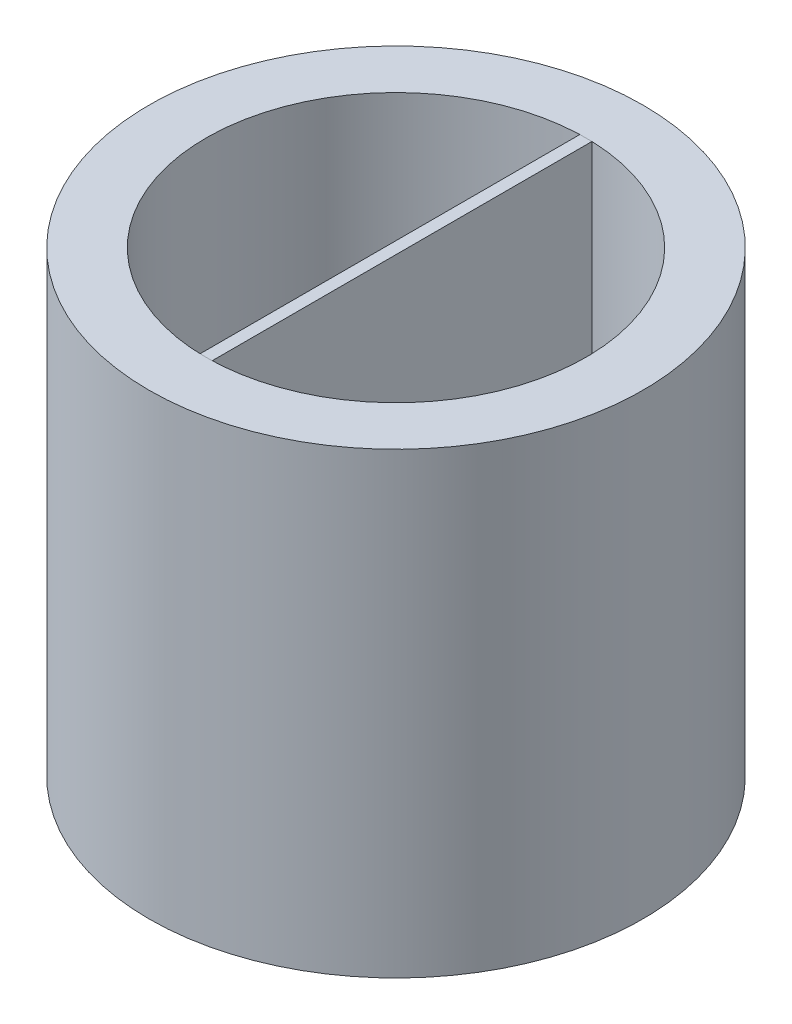
ISO-10303-21;
HEADER;
FILE_DESCRIPTION(('STEP AP214'),'2;1');
FILE_NAME('part.step','',(''),(''),'','','');
FILE_SCHEMA(('AUTOMOTIVE_DESIGN { 1 0 10303 214 1 1 1 1 }'));
ENDSEC;
DATA;
#1=APPLICATION_CONTEXT('core data for automotive mechanical design processes');
#2=APPLICATION_PROTOCOL_DEFINITION('international standard','automotive_design',2000,#1);
#3=PRODUCT_CONTEXT('',#1,'mechanical');
#4=PRODUCT('Part','Part','',(#3));
#5=PRODUCT_RELATED_PRODUCT_CATEGORY('part','',(#4));
#6=PRODUCT_DEFINITION_FORMATION('','',#4);
#7=PRODUCT_DEFINITION_CONTEXT('part definition',#1,'design');
#8=PRODUCT_DEFINITION('design','',#6,#7);
#9=PRODUCT_DEFINITION_SHAPE('','',#8);
#10=(LENGTH_UNIT() NAMED_UNIT(*) SI_UNIT(.MILLI.,.METRE.));
#11=(NAMED_UNIT(*) PLANE_ANGLE_UNIT() SI_UNIT($,.RADIAN.));
#12=(NAMED_UNIT(*) SI_UNIT($,.STERADIAN.) SOLID_ANGLE_UNIT());
#13=UNCERTAINTY_MEASURE_WITH_UNIT(LENGTH_MEASURE(1.E-05),#10,'distance_accuracy_value','');
#14=(GEOMETRIC_REPRESENTATION_CONTEXT(3) GLOBAL_UNCERTAINTY_ASSIGNED_CONTEXT((#13)) GLOBAL_UNIT_ASSIGNED_CONTEXT((#10,
#11,#12)) REPRESENTATION_CONTEXT('',''));
#15=CARTESIAN_POINT('',(0.,0.,0.));
#16=DIRECTION('',(0.,0.,1.));
#17=DIRECTION('',(1.,0.,0.));
#18=AXIS2_PLACEMENT_3D('',#15,#16,#17);
#19=CARTESIAN_POINT('',(-3.175,241.01,-99.9495841662185));
#20=DIRECTION('',(0.,0.,1.));
#21=DIRECTION('',(1.,0.,0.));
#22=AXIS2_PLACEMENT_3D('',#19,#20,#21);
#23=PLANE('',#22);
#24=DIRECTION('',(-1.,0.,0.));
#25=VECTOR('',#24,1.);
#26=CARTESIAN_POINT('',(-3.175,0.,-99.9495841662185));
#27=LINE('',#26,#25);
#28=CARTESIAN_POINT('',(3.175,0.,-99.9495841662185));
#29=VERTEX_POINT('',#28);
#30=CARTESIAN_POINT('',(-3.175,0.,-99.9495841662185));
#31=VERTEX_POINT('',#30);
#32=EDGE_CURVE('E116',#29,#31,#27,.T.);
#33=ORIENTED_EDGE('',*,*,#32,.T.);
#34=DIRECTION('',(0.,-1.,0.));
#35=VECTOR('',#34,1.);
#36=CARTESIAN_POINT('',(-3.175,241.01,-99.9495841662185));
#37=LINE('',#36,#35);
#38=CARTESIAN_POINT('',(-3.175,241.01,-99.9495841662185));
#39=VERTEX_POINT('',#38);
#40=EDGE_CURVE('E12',#39,#31,#37,.T.);
#41=ORIENTED_EDGE('',*,*,#40,.F.);
#42=DIRECTION('',(-1.,0.,0.));
#43=VECTOR('',#42,1.);
#44=CARTESIAN_POINT('',(-3.175,241.01,-99.9495841662185));
#45=LINE('',#44,#43);
#46=CARTESIAN_POINT('',(3.175,241.01,-99.9495841662185));
#47=VERTEX_POINT('',#46);
#48=EDGE_CURVE('E104',#47,#39,#45,.T.);
#49=ORIENTED_EDGE('',*,*,#48,.F.);
#50=DIRECTION('',(0.,-1.,0.));
#51=VECTOR('',#50,1.);
#52=CARTESIAN_POINT('',(3.175,241.01,-99.9495841662185));
#53=LINE('',#52,#51);
#54=EDGE_CURVE('E112',#47,#29,#53,.T.);
#55=ORIENTED_EDGE('',*,*,#54,.T.);
#56=EDGE_LOOP('',(#33,#41,#49,#55));
#57=FACE_BOUND('',#56,.T.);
#58=ADVANCED_FACE('F53',(#57),#23,.F.);
#59=CARTESIAN_POINT('',(-3.175,241.01,-99.9495841662185));
#60=DIRECTION('',(1.,0.,0.));
#61=DIRECTION('',(0.,0.,-1.));
#62=AXIS2_PLACEMENT_3D('',#59,#60,#61);
#63=PLANE('',#62);
#64=DIRECTION('',(0.,0.,1.));
#65=VECTOR('',#64,1.);
#66=CARTESIAN_POINT('',(-3.175,0.,-99.9495841662185));
#67=LINE('',#66,#65);
#68=CARTESIAN_POINT('',(-3.175,0.,99.9495841662185));
#69=VERTEX_POINT('',#68);
#70=EDGE_CURVE('E108',#31,#69,#67,.T.);
#71=ORIENTED_EDGE('',*,*,#70,.T.);
#72=DIRECTION('',(0.,-1.,0.));
#73=VECTOR('',#72,1.);
#74=CARTESIAN_POINT('',(-3.175,241.01,99.9495841662185));
#75=LINE('',#74,#73);
#76=CARTESIAN_POINT('',(-3.175,241.01,99.9495841662185));
#77=VERTEX_POINT('',#76);
#78=EDGE_CURVE('E61',#77,#69,#75,.T.);
#79=ORIENTED_EDGE('',*,*,#78,.F.);
#80=DIRECTION('',(0.,0.,1.));
#81=VECTOR('',#80,1.);
#82=CARTESIAN_POINT('',(-3.175,241.01,-99.9495841662185));
#83=LINE('',#82,#81);
#84=EDGE_CURVE('E99',#39,#77,#83,.T.);
#85=ORIENTED_EDGE('',*,*,#84,.F.);
#86=ORIENTED_EDGE('',*,*,#40,.T.);
#87=EDGE_LOOP('',(#71,#79,#85,#86));
#88=FACE_BOUND('',#87,.T.);
#89=ADVANCED_FACE('F107',(#88),#63,.F.);
#90=CARTESIAN_POINT('',(-3.175,241.01,99.9495841662185));
#91=DIRECTION('',(0.,0.,-1.));
#92=DIRECTION('',(-1.,0.,0.));
#93=AXIS2_PLACEMENT_3D('',#90,#91,#92);
#94=PLANE('',#93);
#95=DIRECTION('',(1.,0.,0.));
#96=VECTOR('',#95,1.);
#97=CARTESIAN_POINT('',(-3.175,0.,99.9495841662185));
#98=LINE('',#97,#96);
#99=CARTESIAN_POINT('',(3.175,0.,99.9495841662185));
#100=VERTEX_POINT('',#99);
#101=EDGE_CURVE('E86',#69,#100,#98,.T.);
#102=ORIENTED_EDGE('',*,*,#101,.T.);
#103=DIRECTION('',(0.,-1.,0.));
#104=VECTOR('',#103,1.);
#105=CARTESIAN_POINT('',(3.175,241.01,99.9495841662185));
#106=LINE('',#105,#104);
#107=CARTESIAN_POINT('',(3.175,241.01,99.9495841662185));
#108=VERTEX_POINT('',#107);
#109=EDGE_CURVE('E109',#108,#100,#106,.T.);
#110=ORIENTED_EDGE('',*,*,#109,.F.);
#111=DIRECTION('',(1.,0.,0.));
#112=VECTOR('',#111,1.);
#113=CARTESIAN_POINT('',(-3.175,241.01,99.9495841662185));
#114=LINE('',#113,#112);
#115=EDGE_CURVE('E102',#77,#108,#114,.T.);
#116=ORIENTED_EDGE('',*,*,#115,.F.);
#117=ORIENTED_EDGE('',*,*,#78,.T.);
#118=EDGE_LOOP('',(#102,#110,#116,#117));
#119=FACE_BOUND('',#118,.T.);
#120=ADVANCED_FACE('F110',(#119),#94,.F.);
#121=CARTESIAN_POINT('',(3.175,241.01,99.9495841662185));
#122=DIRECTION('',(-1.,0.,0.));
#123=DIRECTION('',(0.,0.,1.));
#124=AXIS2_PLACEMENT_3D('',#121,#122,#123);
#125=PLANE('',#124);
#126=DIRECTION('',(0.,0.,-1.));
#127=VECTOR('',#126,1.);
#128=CARTESIAN_POINT('',(3.175,0.,99.9495841662185));
#129=LINE('',#128,#127);
#130=EDGE_CURVE('E92',#100,#29,#129,.T.);
#131=ORIENTED_EDGE('',*,*,#130,.T.);
#132=ORIENTED_EDGE('',*,*,#54,.F.);
#133=DIRECTION('',(0.,0.,-1.));
#134=VECTOR('',#133,1.);
#135=CARTESIAN_POINT('',(3.175,241.01,99.9495841662185));
#136=LINE('',#135,#134);
#137=EDGE_CURVE('E69',#108,#47,#136,.T.);
#138=ORIENTED_EDGE('',*,*,#137,.F.);
#139=ORIENTED_EDGE('',*,*,#109,.T.);
#140=EDGE_LOOP('',(#131,#132,#138,#139));
#141=FACE_BOUND('',#140,.T.);
#142=ADVANCED_FACE('F123',(#141),#125,.F.);
#143=CARTESIAN_POINT('',(0.,241.01,0.));
#144=DIRECTION('',(0.,1.,0.));
#145=DIRECTION('',(0.,0.,1.));
#146=AXIS2_PLACEMENT_3D('',#143,#144,#145);
#147=PLANE('',#146);
#148=ORIENTED_EDGE('',*,*,#48,.T.);
#149=ORIENTED_EDGE('',*,*,#84,.T.);
#150=ORIENTED_EDGE('',*,*,#115,.T.);
#151=ORIENTED_EDGE('',*,*,#137,.T.);
#152=EDGE_LOOP('',(#148,#149,#150,#151));
#153=FACE_BOUND('',#152,.T.);
#154=ADVANCED_FACE('F100',(#153),#147,.T.);
#155=CARTESIAN_POINT('',(0.,0.,0.));
#156=DIRECTION('',(0.,1.,0.));
#157=DIRECTION('',(0.,0.,1.));
#158=AXIS2_PLACEMENT_3D('',#155,#156,#157);
#159=PLANE('',#158);
#160=ORIENTED_EDGE('',*,*,#32,.F.);
#161=ORIENTED_EDGE('',*,*,#130,.F.);
#162=ORIENTED_EDGE('',*,*,#101,.F.);
#163=ORIENTED_EDGE('',*,*,#70,.F.);
#164=EDGE_LOOP('',(#160,#161,#162,#163));
#165=FACE_BOUND('',#164,.T.);
#166=ADVANCED_FACE('F126',(#165),#159,.F.);
#167=CLOSED_SHELL('',(#58,#89,#120,#142,#154,#166));
#168=MANIFOLD_SOLID_BREP('B2',#167);
#169=CARTESIAN_POINT('',(0.,241.01,0.));
#170=DIRECTION('',(0.,-1.,0.));
#171=DIRECTION('',(0.,0.,-1.));
#172=AXIS2_PLACEMENT_3D('',#169,#170,#171);
#173=CYLINDRICAL_SURFACE('',#172,130.);
#174=CARTESIAN_POINT('',(0.,241.01,0.));
#175=DIRECTION('',(0.,1.,0.));
#176=DIRECTION('',(0.,0.,1.));
#177=AXIS2_PLACEMENT_3D('',#174,#175,#176);
#178=CIRCLE('',#177,130.);
#179=CARTESIAN_POINT('',(0.,241.01,130.));
#180=VERTEX_POINT('',#179);
#181=EDGE_CURVE('E52',#180,#180,#178,.T.);
#182=ORIENTED_EDGE('',*,*,#181,.F.);
#183=EDGE_LOOP('',(#182));
#184=FACE_BOUND('',#183,.T.);
#185=CARTESIAN_POINT('',(0.,0.,0.));
#186=DIRECTION('',(0.,1.,0.));
#187=DIRECTION('',(0.,0.,1.));
#188=AXIS2_PLACEMENT_3D('',#185,#186,#187);
#189=CIRCLE('',#188,130.);
#190=CARTESIAN_POINT('',(0.,0.,130.));
#191=VERTEX_POINT('',#190);
#192=EDGE_CURVE('E179',#191,#191,#189,.T.);
#193=ORIENTED_EDGE('',*,*,#192,.T.);
#194=EDGE_LOOP('',(#193));
#195=FACE_BOUND('',#194,.T.);
#196=ADVANCED_FACE('F176',(#184,#195),#173,.T.);
#197=CARTESIAN_POINT('',(0.,241.01,0.));
#198=DIRECTION('',(0.,1.,0.));
#199=DIRECTION('',(0.,0.,1.));
#200=AXIS2_PLACEMENT_3D('',#197,#198,#199);
#201=PLANE('',#200);
#202=CARTESIAN_POINT('',(0.,241.01,0.));
#203=DIRECTION('',(0.,1.,0.));
#204=DIRECTION('',(0.,0.,1.));
#205=AXIS2_PLACEMENT_3D('',#202,#203,#204);
#206=CIRCLE('',#205,100.);
#207=CARTESIAN_POINT('',(0.,241.01,100.));
#208=VERTEX_POINT('',#207);
#209=EDGE_CURVE('E190',#208,#208,#206,.T.);
#210=ORIENTED_EDGE('',*,*,#209,.F.);
#211=EDGE_LOOP('',(#210));
#212=FACE_BOUND('',#211,.T.);
#213=ORIENTED_EDGE('',*,*,#181,.T.);
#214=EDGE_LOOP('',(#213));
#215=FACE_BOUND('',#214,.T.);
#216=ADVANCED_FACE('F207',(#212,#215),#201,.T.);
#217=CARTESIAN_POINT('',(0.,0.,0.));
#218=DIRECTION('',(0.,1.,0.));
#219=DIRECTION('',(0.,0.,1.));
#220=AXIS2_PLACEMENT_3D('',#217,#218,#219);
#221=PLANE('',#220);
#222=CARTESIAN_POINT('',(0.,0.,0.));
#223=DIRECTION('',(0.,1.,0.));
#224=DIRECTION('',(0.,0.,1.));
#225=AXIS2_PLACEMENT_3D('',#222,#223,#224);
#226=CIRCLE('',#225,100.);
#227=CARTESIAN_POINT('',(0.,0.,100.));
#228=VERTEX_POINT('',#227);
#229=EDGE_CURVE('E188',#228,#228,#226,.T.);
#230=ORIENTED_EDGE('',*,*,#229,.T.);
#231=EDGE_LOOP('',(#230));
#232=FACE_BOUND('',#231,.T.);
#233=ORIENTED_EDGE('',*,*,#192,.F.);
#234=EDGE_LOOP('',(#233));
#235=FACE_BOUND('',#234,.T.);
#236=ADVANCED_FACE('F198',(#232,#235),#221,.F.);
#237=CARTESIAN_POINT('',(0.,0.,0.));
#238=DIRECTION('',(0.,1.,0.));
#239=DIRECTION('',(0.,0.,1.));
#240=AXIS2_PLACEMENT_3D('',#237,#238,#239);
#241=CYLINDRICAL_SURFACE('',#240,100.);
#242=ORIENTED_EDGE('',*,*,#229,.F.);
#243=EDGE_LOOP('',(#242));
#244=FACE_BOUND('',#243,.T.);
#245=ORIENTED_EDGE('',*,*,#209,.T.);
#246=EDGE_LOOP('',(#245));
#247=FACE_BOUND('',#246,.T.);
#248=ADVANCED_FACE('F201',(#244,#247),#241,.F.);
#249=CLOSED_SHELL('',(#196,#216,#236,#248));
#250=MANIFOLD_SOLID_BREP('B6',#249);
#251=ADVANCED_BREP_SHAPE_REPRESENTATION('',(#18,#168,#250),#14);
#252=SHAPE_DEFINITION_REPRESENTATION(#9,#251);
ENDSEC;
END-ISO-10303-21;
